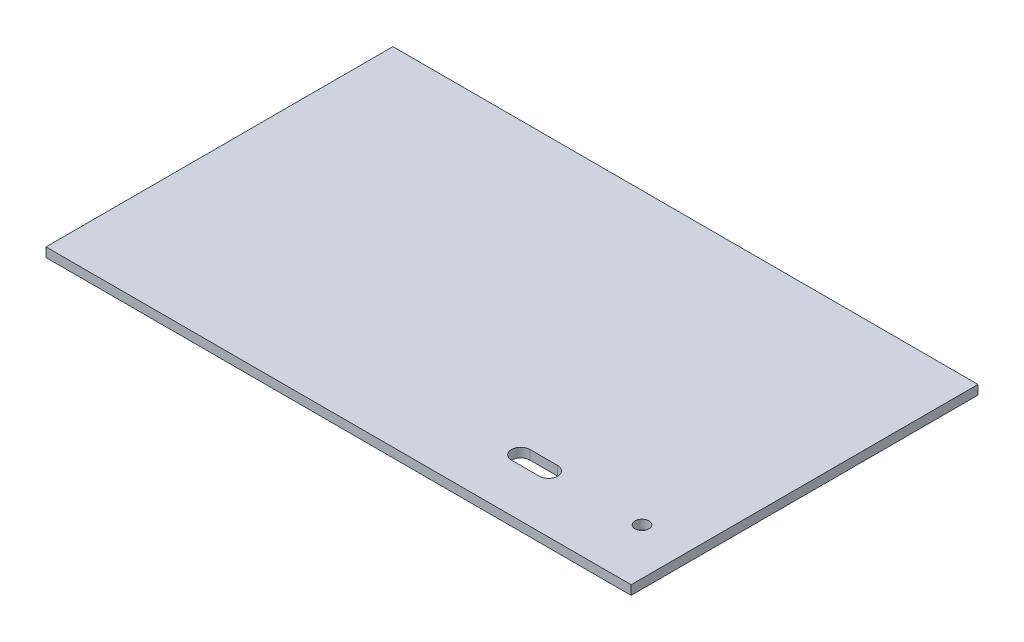
ISO-10303-21;
HEADER;
FILE_DESCRIPTION(('STEP AP214'),'2;1');
FILE_NAME('part.step','',(''),(''),'','','');
FILE_SCHEMA(('AUTOMOTIVE_DESIGN { 1 0 10303 214 1 1 1 1 }'));
ENDSEC;
DATA;
#1=APPLICATION_CONTEXT('core data for automotive mechanical design processes');
#2=APPLICATION_PROTOCOL_DEFINITION('international standard','automotive_design',2000,#1);
#3=PRODUCT_CONTEXT('',#1,'mechanical');
#4=PRODUCT('Part','Part','',(#3));
#5=PRODUCT_RELATED_PRODUCT_CATEGORY('part','',(#4));
#6=PRODUCT_DEFINITION_FORMATION('','',#4);
#7=PRODUCT_DEFINITION_CONTEXT('part definition',#1,'design');
#8=PRODUCT_DEFINITION('design','',#6,#7);
#9=PRODUCT_DEFINITION_SHAPE('','',#8);
#10=(LENGTH_UNIT() NAMED_UNIT(*) SI_UNIT(.MILLI.,.METRE.));
#11=(NAMED_UNIT(*) PLANE_ANGLE_UNIT() SI_UNIT($,.RADIAN.));
#12=(NAMED_UNIT(*) SI_UNIT($,.STERADIAN.) SOLID_ANGLE_UNIT());
#13=UNCERTAINTY_MEASURE_WITH_UNIT(LENGTH_MEASURE(1.E-05),#10,'distance_accuracy_value','');
#14=(GEOMETRIC_REPRESENTATION_CONTEXT(3) GLOBAL_UNCERTAINTY_ASSIGNED_CONTEXT((#13)) GLOBAL_UNIT_ASSIGNED_CONTEXT((#10,
#11,#12)) REPRESENTATION_CONTEXT('',''));
#15=CARTESIAN_POINT('',(0.,0.,0.));
#16=DIRECTION('',(0.,0.,1.));
#17=DIRECTION('',(1.,0.,0.));
#18=AXIS2_PLACEMENT_3D('',#15,#16,#17);
#19=CARTESIAN_POINT('',(-126.5,4.,-75.));
#20=DIRECTION('',(1.,0.,0.));
#21=DIRECTION('',(0.,0.,-1.));
#22=AXIS2_PLACEMENT_3D('',#19,#20,#21);
#23=PLANE('',#22);
#24=DIRECTION('',(0.,0.,1.));
#25=VECTOR('',#24,1.);
#26=CARTESIAN_POINT('',(-126.5,0.,-75.));
#27=LINE('',#26,#25);
#28=CARTESIAN_POINT('',(-126.5,0.,-75.));
#29=VERTEX_POINT('',#28);
#30=CARTESIAN_POINT('',(-126.5,0.,75.));
#31=VERTEX_POINT('',#30);
#32=EDGE_CURVE('E170',#29,#31,#27,.T.);
#33=ORIENTED_EDGE('',*,*,#32,.T.);
#34=DIRECTION('',(0.,-1.,0.));
#35=VECTOR('',#34,1.);
#36=CARTESIAN_POINT('',(-126.5,4.,75.));
#37=LINE('',#36,#35);
#38=CARTESIAN_POINT('',(-126.5,4.,75.));
#39=VERTEX_POINT('',#38);
#40=EDGE_CURVE('E11',#39,#31,#37,.T.);
#41=ORIENTED_EDGE('',*,*,#40,.F.);
#42=DIRECTION('',(0.,0.,1.));
#43=VECTOR('',#42,1.);
#44=CARTESIAN_POINT('',(-126.5,4.,-75.));
#45=LINE('',#44,#43);
#46=CARTESIAN_POINT('',(-126.5,4.,-75.));
#47=VERTEX_POINT('',#46);
#48=EDGE_CURVE('E155',#47,#39,#45,.T.);
#49=ORIENTED_EDGE('',*,*,#48,.F.);
#50=DIRECTION('',(0.,-1.,0.));
#51=VECTOR('',#50,1.);
#52=CARTESIAN_POINT('',(-126.5,4.,-75.));
#53=LINE('',#52,#51);
#54=EDGE_CURVE('E169',#47,#29,#53,.T.);
#55=ORIENTED_EDGE('',*,*,#54,.T.);
#56=EDGE_LOOP('',(#33,#41,#49,#55));
#57=FACE_BOUND('',#56,.T.);
#58=ADVANCED_FACE('F39',(#57),#23,.F.);
#59=CARTESIAN_POINT('',(126.5,4.,75.));
#60=DIRECTION('',(0.,0.,-1.));
#61=DIRECTION('',(-1.,0.,0.));
#62=AXIS2_PLACEMENT_3D('',#59,#60,#61);
#63=PLANE('',#62);
#64=DIRECTION('',(1.,0.,0.));
#65=VECTOR('',#64,1.);
#66=CARTESIAN_POINT('',(126.5,0.,75.));
#67=LINE('',#66,#65);
#68=CARTESIAN_POINT('',(126.5,0.,75.));
#69=VERTEX_POINT('',#68);
#70=EDGE_CURVE('E174',#31,#69,#67,.T.);
#71=ORIENTED_EDGE('',*,*,#70,.T.);
#72=DIRECTION('',(0.,-1.,0.));
#73=VECTOR('',#72,1.);
#74=CARTESIAN_POINT('',(126.5,4.,75.));
#75=LINE('',#74,#73);
#76=CARTESIAN_POINT('',(126.5,4.,75.));
#77=VERTEX_POINT('',#76);
#78=EDGE_CURVE('E47',#77,#69,#75,.T.);
#79=ORIENTED_EDGE('',*,*,#78,.F.);
#80=DIRECTION('',(1.,0.,0.));
#81=VECTOR('',#80,1.);
#82=CARTESIAN_POINT('',(126.5,4.,75.));
#83=LINE('',#82,#81);
#84=EDGE_CURVE('E159',#39,#77,#83,.T.);
#85=ORIENTED_EDGE('',*,*,#84,.F.);
#86=ORIENTED_EDGE('',*,*,#40,.T.);
#87=EDGE_LOOP('',(#71,#79,#85,#86));
#88=FACE_BOUND('',#87,.T.);
#89=ADVANCED_FACE('F209',(#88),#63,.F.);
#90=CARTESIAN_POINT('',(126.5,4.,-75.));
#91=DIRECTION('',(-1.,0.,0.));
#92=DIRECTION('',(0.,0.,1.));
#93=AXIS2_PLACEMENT_3D('',#90,#91,#92);
#94=PLANE('',#93);
#95=DIRECTION('',(0.,0.,-1.));
#96=VECTOR('',#95,1.);
#97=CARTESIAN_POINT('',(126.5,0.,-75.));
#98=LINE('',#97,#96);
#99=CARTESIAN_POINT('',(126.5,0.,-75.));
#100=VERTEX_POINT('',#99);
#101=EDGE_CURVE('E178',#69,#100,#98,.T.);
#102=ORIENTED_EDGE('',*,*,#101,.T.);
#103=DIRECTION('',(0.,-1.,0.));
#104=VECTOR('',#103,1.);
#105=CARTESIAN_POINT('',(126.5,4.,-75.));
#106=LINE('',#105,#104);
#107=CARTESIAN_POINT('',(126.5,4.,-75.));
#108=VERTEX_POINT('',#107);
#109=EDGE_CURVE('E186',#108,#100,#106,.T.);
#110=ORIENTED_EDGE('',*,*,#109,.F.);
#111=DIRECTION('',(0.,0.,-1.));
#112=VECTOR('',#111,1.);
#113=CARTESIAN_POINT('',(126.5,4.,-75.));
#114=LINE('',#113,#112);
#115=EDGE_CURVE('E163',#77,#108,#114,.T.);
#116=ORIENTED_EDGE('',*,*,#115,.F.);
#117=ORIENTED_EDGE('',*,*,#78,.T.);
#118=EDGE_LOOP('',(#102,#110,#116,#117));
#119=FACE_BOUND('',#118,.T.);
#120=ADVANCED_FACE('F195',(#119),#94,.F.);
#121=CARTESIAN_POINT('',(126.5,4.,-75.));
#122=DIRECTION('',(0.,0.,1.));
#123=DIRECTION('',(1.,0.,0.));
#124=AXIS2_PLACEMENT_3D('',#121,#122,#123);
#125=PLANE('',#124);
#126=DIRECTION('',(-1.,0.,0.));
#127=VECTOR('',#126,1.);
#128=CARTESIAN_POINT('',(126.5,0.,-75.));
#129=LINE('',#128,#127);
#130=EDGE_CURVE('E160',#100,#29,#129,.T.);
#131=ORIENTED_EDGE('',*,*,#130,.T.);
#132=ORIENTED_EDGE('',*,*,#54,.F.);
#133=DIRECTION('',(-1.,0.,0.));
#134=VECTOR('',#133,1.);
#135=CARTESIAN_POINT('',(126.5,4.,-75.));
#136=LINE('',#135,#134);
#137=EDGE_CURVE('E166',#108,#47,#136,.T.);
#138=ORIENTED_EDGE('',*,*,#137,.F.);
#139=ORIENTED_EDGE('',*,*,#109,.T.);
#140=EDGE_LOOP('',(#131,#132,#138,#139));
#141=FACE_BOUND('',#140,.T.);
#142=ADVANCED_FACE('F202',(#141),#125,.F.);
#143=CARTESIAN_POINT('',(0.,4.,0.));
#144=DIRECTION('',(0.,-1.,0.));
#145=DIRECTION('',(0.,0.,-1.));
#146=AXIS2_PLACEMENT_3D('',#143,#144,#145);
#147=PLANE('',#146);
#148=CARTESIAN_POINT('',(106.44003959124,4.,50.2277682136688));
#149=DIRECTION('',(0.,1.,0.));
#150=DIRECTION('',(0.,0.,1.));
#151=AXIS2_PLACEMENT_3D('',#148,#149,#150);
#152=CIRCLE('',#151,2.99999999999999);
#153=CARTESIAN_POINT('',(106.44003959124,4.,53.2277682136688));
#154=VERTEX_POINT('',#153);
#155=EDGE_CURVE('E132',#154,#154,#152,.T.);
#156=ORIENTED_EDGE('',*,*,#155,.F.);
#157=EDGE_LOOP('',(#156));
#158=FACE_BOUND('',#157,.T.);
#159=DIRECTION('',(-1.,0.,0.));
#160=VECTOR('',#159,1.);
#161=CARTESIAN_POINT('',(66.,4.,46.2277682136688));
#162=LINE('',#161,#160);
#163=CARTESIAN_POINT('',(66.,4.,46.2277682136688));
#164=VERTEX_POINT('',#163);
#165=CARTESIAN_POINT('',(54.,4.,46.2277682136688));
#166=VERTEX_POINT('',#165);
#167=EDGE_CURVE('E141',#164,#166,#162,.T.);
#168=ORIENTED_EDGE('',*,*,#167,.F.);
#169=CARTESIAN_POINT('',(66.,4.,50.2277682136688));
#170=DIRECTION('',(0.,1.,0.));
#171=DIRECTION('',(0.,0.,1.));
#172=AXIS2_PLACEMENT_3D('',#169,#170,#171);
#173=CIRCLE('',#172,4.);
#174=CARTESIAN_POINT('',(66.,4.,54.2277682136688));
#175=VERTEX_POINT('',#174);
#176=EDGE_CURVE('E54',#175,#164,#173,.T.);
#177=ORIENTED_EDGE('',*,*,#176,.F.);
#178=DIRECTION('',(1.,0.,0.));
#179=VECTOR('',#178,1.);
#180=CARTESIAN_POINT('',(66.,4.,54.2277682136688));
#181=LINE('',#180,#179);
#182=CARTESIAN_POINT('',(54.,4.,54.2277682136688));
#183=VERTEX_POINT('',#182);
#184=EDGE_CURVE('E125',#183,#175,#181,.T.);
#185=ORIENTED_EDGE('',*,*,#184,.F.);
#186=CARTESIAN_POINT('',(54.,4.,50.2277682136688));
#187=DIRECTION('',(0.,1.,0.));
#188=DIRECTION('',(0.,0.,1.));
#189=AXIS2_PLACEMENT_3D('',#186,#187,#188);
#190=CIRCLE('',#189,4.);
#191=EDGE_CURVE('E129',#166,#183,#190,.T.);
#192=ORIENTED_EDGE('',*,*,#191,.F.);
#193=EDGE_LOOP('',(#168,#177,#185,#192));
#194=FACE_BOUND('',#193,.T.);
#195=ORIENTED_EDGE('',*,*,#48,.T.);
#196=ORIENTED_EDGE('',*,*,#84,.T.);
#197=ORIENTED_EDGE('',*,*,#115,.T.);
#198=ORIENTED_EDGE('',*,*,#137,.T.);
#199=EDGE_LOOP('',(#195,#196,#197,#198));
#200=FACE_BOUND('',#199,.T.);
#201=ADVANCED_FACE('F208',(#158,#194,#200),#147,.F.);
#202=CARTESIAN_POINT('',(0.,0.,0.));
#203=DIRECTION('',(0.,-1.,0.));
#204=DIRECTION('',(0.,0.,-1.));
#205=AXIS2_PLACEMENT_3D('',#202,#203,#204);
#206=PLANE('',#205);
#207=CARTESIAN_POINT('',(106.44003959124,0.,50.2277682136688));
#208=DIRECTION('',(0.,1.,0.));
#209=DIRECTION('',(0.,0.,1.));
#210=AXIS2_PLACEMENT_3D('',#207,#208,#209);
#211=CIRCLE('',#210,2.99999999999999);
#212=CARTESIAN_POINT('',(106.44003959124,0.,53.2277682136688));
#213=VERTEX_POINT('',#212);
#214=EDGE_CURVE('E175',#213,#213,#211,.T.);
#215=ORIENTED_EDGE('',*,*,#214,.T.);
#216=EDGE_LOOP('',(#215));
#217=FACE_BOUND('',#216,.T.);
#218=CARTESIAN_POINT('',(66.,0.,50.2277682136688));
#219=DIRECTION('',(0.,1.,0.));
#220=DIRECTION('',(0.,0.,1.));
#221=AXIS2_PLACEMENT_3D('',#218,#219,#220);
#222=CIRCLE('',#221,4.);
#223=CARTESIAN_POINT('',(66.,0.,54.2277682136688));
#224=VERTEX_POINT('',#223);
#225=CARTESIAN_POINT('',(66.,0.,46.2277682136688));
#226=VERTEX_POINT('',#225);
#227=EDGE_CURVE('E106',#224,#226,#222,.T.);
#228=ORIENTED_EDGE('',*,*,#227,.T.);
#229=DIRECTION('',(-1.,0.,0.));
#230=VECTOR('',#229,1.);
#231=CARTESIAN_POINT('',(66.,0.,46.2277682136688));
#232=LINE('',#231,#230);
#233=CARTESIAN_POINT('',(54.,0.,46.2277682136688));
#234=VERTEX_POINT('',#233);
#235=EDGE_CURVE('E116',#226,#234,#232,.T.);
#236=ORIENTED_EDGE('',*,*,#235,.T.);
#237=CARTESIAN_POINT('',(54.,0.,50.2277682136688));
#238=DIRECTION('',(0.,1.,0.));
#239=DIRECTION('',(0.,0.,1.));
#240=AXIS2_PLACEMENT_3D('',#237,#238,#239);
#241=CIRCLE('',#240,4.);
#242=CARTESIAN_POINT('',(54.,0.,54.2277682136688));
#243=VERTEX_POINT('',#242);
#244=EDGE_CURVE('E62',#234,#243,#241,.T.);
#245=ORIENTED_EDGE('',*,*,#244,.T.);
#246=DIRECTION('',(1.,0.,0.));
#247=VECTOR('',#246,1.);
#248=CARTESIAN_POINT('',(66.,0.,54.2277682136688));
#249=LINE('',#248,#247);
#250=EDGE_CURVE('E113',#243,#224,#249,.T.);
#251=ORIENTED_EDGE('',*,*,#250,.T.);
#252=EDGE_LOOP('',(#228,#236,#245,#251));
#253=FACE_BOUND('',#252,.T.);
#254=ORIENTED_EDGE('',*,*,#32,.F.);
#255=ORIENTED_EDGE('',*,*,#130,.F.);
#256=ORIENTED_EDGE('',*,*,#101,.F.);
#257=ORIENTED_EDGE('',*,*,#70,.F.);
#258=EDGE_LOOP('',(#254,#255,#256,#257));
#259=FACE_BOUND('',#258,.T.);
#260=ADVANCED_FACE('F121',(#217,#253,#259),#206,.T.);
#261=CARTESIAN_POINT('',(66.,0.,50.2277682136688));
#262=DIRECTION('',(0.,1.,0.));
#263=DIRECTION('',(0.,0.,1.));
#264=AXIS2_PLACEMENT_3D('',#261,#262,#263);
#265=CYLINDRICAL_SURFACE('',#264,4.);
#266=ORIENTED_EDGE('',*,*,#176,.T.);
#267=DIRECTION('',(0.,1.,0.));
#268=VECTOR('',#267,1.);
#269=CARTESIAN_POINT('',(66.,0.,46.2277682136688));
#270=LINE('',#269,#268);
#271=EDGE_CURVE('E102',#226,#164,#270,.T.);
#272=ORIENTED_EDGE('',*,*,#271,.F.);
#273=ORIENTED_EDGE('',*,*,#227,.F.);
#274=DIRECTION('',(0.,1.,0.));
#275=VECTOR('',#274,1.);
#276=CARTESIAN_POINT('',(66.,0.,54.2277682136688));
#277=LINE('',#276,#275);
#278=EDGE_CURVE('E147',#224,#175,#277,.T.);
#279=ORIENTED_EDGE('',*,*,#278,.T.);
#280=EDGE_LOOP('',(#266,#272,#273,#279));
#281=FACE_BOUND('',#280,.T.);
#282=ADVANCED_FACE('F104',(#281),#265,.F.);
#283=CARTESIAN_POINT('',(66.,0.,54.2277682136688));
#284=DIRECTION('',(0.,0.,1.));
#285=DIRECTION('',(1.,0.,0.));
#286=AXIS2_PLACEMENT_3D('',#283,#284,#285);
#287=PLANE('',#286);
#288=ORIENTED_EDGE('',*,*,#184,.T.);
#289=ORIENTED_EDGE('',*,*,#278,.F.);
#290=ORIENTED_EDGE('',*,*,#250,.F.);
#291=DIRECTION('',(0.,1.,0.));
#292=VECTOR('',#291,1.);
#293=CARTESIAN_POINT('',(54.,0.,54.2277682136688));
#294=LINE('',#293,#292);
#295=EDGE_CURVE('E150',#243,#183,#294,.T.);
#296=ORIENTED_EDGE('',*,*,#295,.T.);
#297=EDGE_LOOP('',(#288,#289,#290,#296));
#298=FACE_BOUND('',#297,.T.);
#299=ADVANCED_FACE('F227',(#298),#287,.F.);
#300=CARTESIAN_POINT('',(54.,0.,50.2277682136688));
#301=DIRECTION('',(0.,1.,0.));
#302=DIRECTION('',(0.,0.,1.));
#303=AXIS2_PLACEMENT_3D('',#300,#301,#302);
#304=CYLINDRICAL_SURFACE('',#303,4.);
#305=ORIENTED_EDGE('',*,*,#191,.T.);
#306=ORIENTED_EDGE('',*,*,#295,.F.);
#307=ORIENTED_EDGE('',*,*,#244,.F.);
#308=DIRECTION('',(0.,1.,0.));
#309=VECTOR('',#308,1.);
#310=CARTESIAN_POINT('',(54.,0.,46.2277682136688));
#311=LINE('',#310,#309);
#312=EDGE_CURVE('E112',#234,#166,#311,.T.);
#313=ORIENTED_EDGE('',*,*,#312,.T.);
#314=EDGE_LOOP('',(#305,#306,#307,#313));
#315=FACE_BOUND('',#314,.T.);
#316=ADVANCED_FACE('F231',(#315),#304,.F.);
#317=CARTESIAN_POINT('',(66.,0.,46.2277682136688));
#318=DIRECTION('',(0.,0.,-1.));
#319=DIRECTION('',(-1.,0.,0.));
#320=AXIS2_PLACEMENT_3D('',#317,#318,#319);
#321=PLANE('',#320);
#322=ORIENTED_EDGE('',*,*,#167,.T.);
#323=ORIENTED_EDGE('',*,*,#312,.F.);
#324=ORIENTED_EDGE('',*,*,#235,.F.);
#325=ORIENTED_EDGE('',*,*,#271,.T.);
#326=EDGE_LOOP('',(#322,#323,#324,#325));
#327=FACE_BOUND('',#326,.T.);
#328=ADVANCED_FACE('F117',(#327),#321,.F.);
#329=CARTESIAN_POINT('',(106.44003959124,0.,50.2277682136688));
#330=DIRECTION('',(0.,1.,0.));
#331=DIRECTION('',(0.,0.,1.));
#332=AXIS2_PLACEMENT_3D('',#329,#330,#331);
#333=CYLINDRICAL_SURFACE('',#332,2.99999999999999);
#334=ORIENTED_EDGE('',*,*,#214,.F.);
#335=EDGE_LOOP('',(#334));
#336=FACE_BOUND('',#335,.T.);
#337=ORIENTED_EDGE('',*,*,#155,.T.);
#338=EDGE_LOOP('',(#337));
#339=FACE_BOUND('',#338,.T.);
#340=ADVANCED_FACE('F230',(#336,#339),#333,.F.);
#341=CLOSED_SHELL('',(#58,#89,#120,#142,#201,#260,#282,#299,#316,#328,#340));
#342=MANIFOLD_SOLID_BREP('B2',#341);
#343=ADVANCED_BREP_SHAPE_REPRESENTATION('',(#18,#342),#14);
#344=SHAPE_DEFINITION_REPRESENTATION(#9,#343);
ENDSEC;
END-ISO-10303-21;
